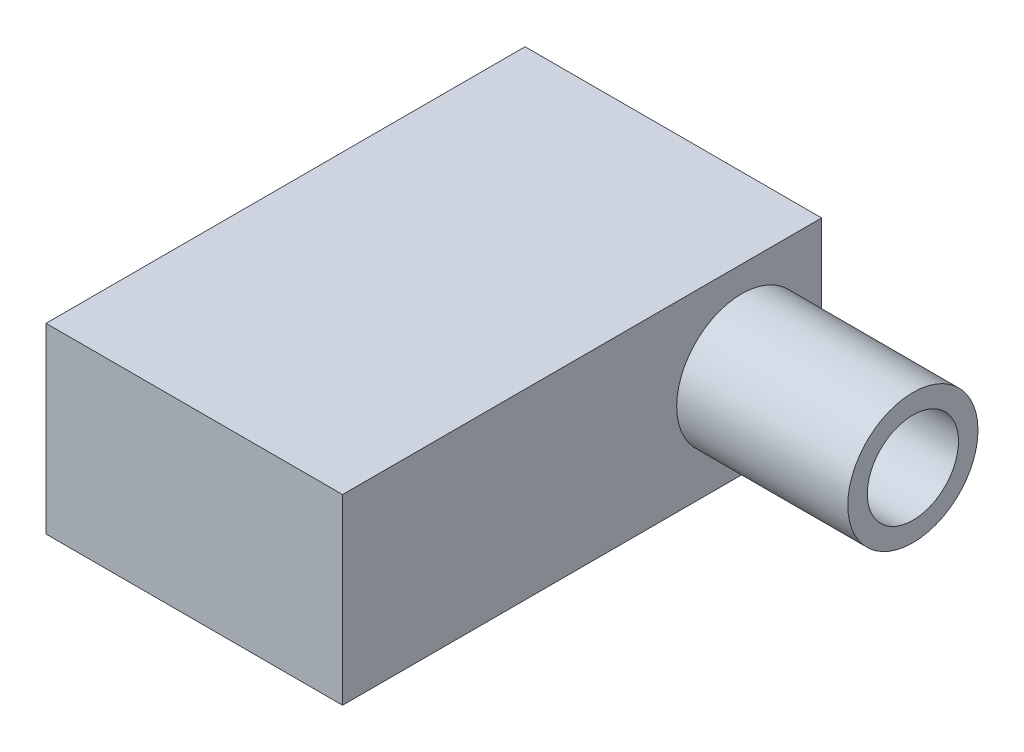
ISO-10303-21;
HEADER;
FILE_DESCRIPTION(('STEP AP214'),'2;1');
FILE_NAME('part.step','',(''),(''),'','','');
FILE_SCHEMA(('AUTOMOTIVE_DESIGN { 1 0 10303 214 1 1 1 1 }'));
ENDSEC;
DATA;
#1=APPLICATION_CONTEXT('core data for automotive mechanical design processes');
#2=APPLICATION_PROTOCOL_DEFINITION('international standard','automotive_design',2000,#1);
#3=PRODUCT_CONTEXT('',#1,'mechanical');
#4=PRODUCT('Part','Part','',(#3));
#5=PRODUCT_RELATED_PRODUCT_CATEGORY('part','',(#4));
#6=PRODUCT_DEFINITION_FORMATION('','',#4);
#7=PRODUCT_DEFINITION_CONTEXT('part definition',#1,'design');
#8=PRODUCT_DEFINITION('design','',#6,#7);
#9=PRODUCT_DEFINITION_SHAPE('','',#8);
#10=(LENGTH_UNIT() NAMED_UNIT(*) SI_UNIT(.MILLI.,.METRE.));
#11=(NAMED_UNIT(*) PLANE_ANGLE_UNIT() SI_UNIT($,.RADIAN.));
#12=(NAMED_UNIT(*) SI_UNIT($,.STERADIAN.) SOLID_ANGLE_UNIT());
#13=UNCERTAINTY_MEASURE_WITH_UNIT(LENGTH_MEASURE(1.E-05),#10,'distance_accuracy_value','');
#14=(GEOMETRIC_REPRESENTATION_CONTEXT(3) GLOBAL_UNCERTAINTY_ASSIGNED_CONTEXT((#13)) GLOBAL_UNIT_ASSIGNED_CONTEXT((#10,
#11,#12)) REPRESENTATION_CONTEXT('',''));
#15=CARTESIAN_POINT('',(0.,0.,0.));
#16=DIRECTION('',(0.,0.,1.));
#17=DIRECTION('',(1.,0.,0.));
#18=AXIS2_PLACEMENT_3D('',#15,#16,#17);
#19=CARTESIAN_POINT('',(0.,0.,0.));
#20=DIRECTION('',(0.,0.,1.));
#21=DIRECTION('',(1.,0.,0.));
#22=AXIS2_PLACEMENT_3D('',#19,#20,#21);
#23=PLANE('',#22);
#24=DIRECTION('',(0.,-1.,0.));
#25=VECTOR('',#24,1.);
#26=CARTESIAN_POINT('',(0.,0.,0.));
#27=LINE('',#26,#25);
#28=CARTESIAN_POINT('',(0.,0.,0.));
#29=VERTEX_POINT('',#28);
#30=CARTESIAN_POINT('',(0.,-80.,0.));
#31=VERTEX_POINT('',#30);
#32=EDGE_CURVE('E122',#29,#31,#27,.T.);
#33=ORIENTED_EDGE('',*,*,#32,.F.);
#34=DIRECTION('',(-1.,0.,0.));
#35=VECTOR('',#34,1.);
#36=CARTESIAN_POINT('',(0.,0.,0.));
#37=LINE('',#36,#35);
#38=CARTESIAN_POINT('',(130.,0.,0.));
#39=VERTEX_POINT('',#38);
#40=EDGE_CURVE('E202',#39,#29,#37,.T.);
#41=ORIENTED_EDGE('',*,*,#40,.F.);
#42=DIRECTION('',(0.,1.,0.));
#43=VECTOR('',#42,1.);
#44=CARTESIAN_POINT('',(130.,0.,0.));
#45=LINE('',#44,#43);
#46=CARTESIAN_POINT('',(130.,-80.,0.));
#47=VERTEX_POINT('',#46);
#48=EDGE_CURVE('E199',#47,#39,#45,.T.);
#49=ORIENTED_EDGE('',*,*,#48,.F.);
#50=DIRECTION('',(1.,0.,0.));
#51=VECTOR('',#50,1.);
#52=CARTESIAN_POINT('',(0.,-80.,0.));
#53=LINE('',#52,#51);
#54=EDGE_CURVE('E196',#31,#47,#53,.T.);
#55=ORIENTED_EDGE('',*,*,#54,.F.);
#56=EDGE_LOOP('',(#33,#41,#49,#55));
#57=FACE_BOUND('',#56,.T.);
#58=DIRECTION('',(0.,-1.,0.));
#59=VECTOR('',#58,1.);
#60=CARTESIAN_POINT('',(10.,-10.,0.));
#61=LINE('',#60,#59);
#62=CARTESIAN_POINT('',(10.,-10.,0.));
#63=VERTEX_POINT('',#62);
#64=CARTESIAN_POINT('',(10.,-70.,0.));
#65=VERTEX_POINT('',#64);
#66=EDGE_CURVE('E72',#63,#65,#61,.T.);
#67=ORIENTED_EDGE('',*,*,#66,.T.);
#68=DIRECTION('',(1.,0.,0.));
#69=VECTOR('',#68,1.);
#70=CARTESIAN_POINT('',(10.,-70.,0.));
#71=LINE('',#70,#69);
#72=CARTESIAN_POINT('',(120.,-70.,0.));
#73=VERTEX_POINT('',#72);
#74=EDGE_CURVE('E172',#65,#73,#71,.T.);
#75=ORIENTED_EDGE('',*,*,#74,.T.);
#76=DIRECTION('',(0.,1.,0.));
#77=VECTOR('',#76,1.);
#78=CARTESIAN_POINT('',(120.,-10.,0.));
#79=LINE('',#78,#77);
#80=CARTESIAN_POINT('',(120.,-10.,0.));
#81=VERTEX_POINT('',#80);
#82=EDGE_CURVE('E176',#73,#81,#79,.T.);
#83=ORIENTED_EDGE('',*,*,#82,.T.);
#84=DIRECTION('',(-1.,0.,0.));
#85=VECTOR('',#84,1.);
#86=CARTESIAN_POINT('',(10.,-10.,0.));
#87=LINE('',#86,#85);
#88=EDGE_CURVE('E159',#81,#63,#87,.T.);
#89=ORIENTED_EDGE('',*,*,#88,.T.);
#90=EDGE_LOOP('',(#67,#75,#83,#89));
#91=FACE_BOUND('',#90,.T.);
#92=ADVANCED_FACE('F47',(#57,#91),#23,.F.);
#93=CARTESIAN_POINT('',(0.,0.,200.));
#94=DIRECTION('',(1.,0.,0.));
#95=DIRECTION('',(0.,1.,0.));
#96=AXIS2_PLACEMENT_3D('',#93,#94,#95);
#97=PLANE('',#96);
#98=ORIENTED_EDGE('',*,*,#32,.T.);
#99=DIRECTION('',(0.,0.,-1.));
#100=VECTOR('',#99,1.);
#101=CARTESIAN_POINT('',(0.,-80.,200.));
#102=LINE('',#101,#100);
#103=CARTESIAN_POINT('',(0.,-80.,210.));
#104=VERTEX_POINT('',#103);
#105=EDGE_CURVE('E57',#104,#31,#102,.T.);
#106=ORIENTED_EDGE('',*,*,#105,.F.);
#107=DIRECTION('',(0.,-1.,0.));
#108=VECTOR('',#107,1.);
#109=CARTESIAN_POINT('',(0.,0.,210.));
#110=LINE('',#109,#108);
#111=CARTESIAN_POINT('',(0.,0.,210.));
#112=VERTEX_POINT('',#111);
#113=EDGE_CURVE('E120',#112,#104,#110,.T.);
#114=ORIENTED_EDGE('',*,*,#113,.F.);
#115=DIRECTION('',(0.,0.,-1.));
#116=VECTOR('',#115,1.);
#117=CARTESIAN_POINT('',(0.,0.,200.));
#118=LINE('',#117,#116);
#119=EDGE_CURVE('E205',#112,#29,#118,.T.);
#120=ORIENTED_EDGE('',*,*,#119,.T.);
#121=EDGE_LOOP('',(#98,#106,#114,#120));
#122=FACE_BOUND('',#121,.T.);
#123=ADVANCED_FACE('F49',(#122),#97,.F.);
#124=CARTESIAN_POINT('',(0.,-80.,200.));
#125=DIRECTION('',(0.,1.,0.));
#126=DIRECTION('',(0.,0.,1.));
#127=AXIS2_PLACEMENT_3D('',#124,#125,#126);
#128=PLANE('',#127);
#129=ORIENTED_EDGE('',*,*,#54,.T.);
#130=DIRECTION('',(0.,0.,-1.));
#131=VECTOR('',#130,1.);
#132=CARTESIAN_POINT('',(130.,-80.,200.));
#133=LINE('',#132,#131);
#134=CARTESIAN_POINT('',(130.,-80.,210.));
#135=VERTEX_POINT('',#134);
#136=EDGE_CURVE('E125',#135,#47,#133,.T.);
#137=ORIENTED_EDGE('',*,*,#136,.F.);
#138=DIRECTION('',(1.,0.,0.));
#139=VECTOR('',#138,1.);
#140=CARTESIAN_POINT('',(0.,-80.,210.));
#141=LINE('',#140,#139);
#142=EDGE_CURVE('E128',#104,#135,#141,.T.);
#143=ORIENTED_EDGE('',*,*,#142,.F.);
#144=ORIENTED_EDGE('',*,*,#105,.T.);
#145=EDGE_LOOP('',(#129,#137,#143,#144));
#146=FACE_BOUND('',#145,.T.);
#147=ADVANCED_FACE('F129',(#146),#128,.F.);
#148=CARTESIAN_POINT('',(130.,0.,200.));
#149=DIRECTION('',(-1.,0.,0.));
#150=DIRECTION('',(0.,0.,1.));
#151=AXIS2_PLACEMENT_3D('',#148,#149,#150);
#152=PLANE('',#151);
#153=CARTESIAN_POINT('',(130.,-39.7809153899423,35.0024670867136));
#154=DIRECTION('',(-1.,0.,0.));
#155=DIRECTION('',(0.,0.,1.));
#156=AXIS2_PLACEMENT_3D('',#153,#154,#155);
#157=CIRCLE('',#156,28.5357178964203);
#158=CARTESIAN_POINT('',(130.,-39.7809153899423,63.5381849831339));
#159=VERTEX_POINT('',#158);
#160=EDGE_CURVE('E11',#159,#159,#157,.F.);
#161=ORIENTED_EDGE('',*,*,#160,.F.);
#162=EDGE_LOOP('',(#161));
#163=FACE_BOUND('',#162,.T.);
#164=ORIENTED_EDGE('',*,*,#48,.T.);
#165=DIRECTION('',(0.,0.,-1.));
#166=VECTOR('',#165,1.);
#167=CARTESIAN_POINT('',(130.,0.,200.));
#168=LINE('',#167,#166);
#169=CARTESIAN_POINT('',(130.,0.,210.));
#170=VERTEX_POINT('',#169);
#171=EDGE_CURVE('E208',#170,#39,#168,.T.);
#172=ORIENTED_EDGE('',*,*,#171,.F.);
#173=DIRECTION('',(0.,1.,0.));
#174=VECTOR('',#173,1.);
#175=CARTESIAN_POINT('',(130.,0.,210.));
#176=LINE('',#175,#174);
#177=EDGE_CURVE('E135',#135,#170,#176,.T.);
#178=ORIENTED_EDGE('',*,*,#177,.F.);
#179=ORIENTED_EDGE('',*,*,#136,.T.);
#180=EDGE_LOOP('',(#164,#172,#178,#179));
#181=FACE_BOUND('',#180,.T.);
#182=ADVANCED_FACE('F215',(#163,#181),#152,.F.);
#183=CARTESIAN_POINT('',(0.,0.,200.));
#184=DIRECTION('',(0.,-1.,0.));
#185=DIRECTION('',(0.,0.,-1.));
#186=AXIS2_PLACEMENT_3D('',#183,#184,#185);
#187=PLANE('',#186);
#188=ORIENTED_EDGE('',*,*,#40,.T.);
#189=ORIENTED_EDGE('',*,*,#119,.F.);
#190=DIRECTION('',(-1.,0.,0.));
#191=VECTOR('',#190,1.);
#192=CARTESIAN_POINT('',(0.,0.,210.));
#193=LINE('',#192,#191);
#194=EDGE_CURVE('E140',#170,#112,#193,.T.);
#195=ORIENTED_EDGE('',*,*,#194,.F.);
#196=ORIENTED_EDGE('',*,*,#171,.T.);
#197=EDGE_LOOP('',(#188,#189,#195,#196));
#198=FACE_BOUND('',#197,.T.);
#199=ADVANCED_FACE('F220',(#198),#187,.F.);
#200=CARTESIAN_POINT('',(10.,-10.,200.));
#201=DIRECTION('',(1.,0.,0.));
#202=DIRECTION('',(0.,1.,0.));
#203=AXIS2_PLACEMENT_3D('',#200,#201,#202);
#204=PLANE('',#203);
#205=ORIENTED_EDGE('',*,*,#66,.F.);
#206=DIRECTION('',(0.,0.,-1.));
#207=VECTOR('',#206,1.);
#208=CARTESIAN_POINT('',(10.,-10.,200.));
#209=LINE('',#208,#207);
#210=CARTESIAN_POINT('',(10.,-10.,200.));
#211=VERTEX_POINT('',#210);
#212=EDGE_CURVE('E169',#211,#63,#209,.T.);
#213=ORIENTED_EDGE('',*,*,#212,.F.);
#214=DIRECTION('',(0.,-1.,0.));
#215=VECTOR('',#214,1.);
#216=CARTESIAN_POINT('',(10.,-10.,200.));
#217=LINE('',#216,#215);
#218=CARTESIAN_POINT('',(10.,-70.,200.));
#219=VERTEX_POINT('',#218);
#220=EDGE_CURVE('E154',#211,#219,#217,.T.);
#221=ORIENTED_EDGE('',*,*,#220,.T.);
#222=DIRECTION('',(0.,0.,-1.));
#223=VECTOR('',#222,1.);
#224=CARTESIAN_POINT('',(10.,-70.,200.));
#225=LINE('',#224,#223);
#226=EDGE_CURVE('E191',#219,#65,#225,.T.);
#227=ORIENTED_EDGE('',*,*,#226,.T.);
#228=EDGE_LOOP('',(#205,#213,#221,#227));
#229=FACE_BOUND('',#228,.T.);
#230=ADVANCED_FACE('F222',(#229),#204,.T.);
#231=CARTESIAN_POINT('',(10.,-70.,200.));
#232=DIRECTION('',(0.,1.,0.));
#233=DIRECTION('',(0.,0.,1.));
#234=AXIS2_PLACEMENT_3D('',#231,#232,#233);
#235=PLANE('',#234);
#236=ORIENTED_EDGE('',*,*,#74,.F.);
#237=ORIENTED_EDGE('',*,*,#226,.F.);
#238=DIRECTION('',(1.,0.,0.));
#239=VECTOR('',#238,1.);
#240=CARTESIAN_POINT('',(10.,-70.,200.));
#241=LINE('',#240,#239);
#242=CARTESIAN_POINT('',(120.,-70.,200.));
#243=VERTEX_POINT('',#242);
#244=EDGE_CURVE('E158',#219,#243,#241,.T.);
#245=ORIENTED_EDGE('',*,*,#244,.T.);
#246=DIRECTION('',(0.,0.,-1.));
#247=VECTOR('',#246,1.);
#248=CARTESIAN_POINT('',(120.,-70.,200.));
#249=LINE('',#248,#247);
#250=EDGE_CURVE('E188',#243,#73,#249,.T.);
#251=ORIENTED_EDGE('',*,*,#250,.T.);
#252=EDGE_LOOP('',(#236,#237,#245,#251));
#253=FACE_BOUND('',#252,.T.);
#254=ADVANCED_FACE('F228',(#253),#235,.T.);
#255=CARTESIAN_POINT('',(120.,-10.,200.));
#256=DIRECTION('',(-1.,0.,0.));
#257=DIRECTION('',(0.,-1.,0.));
#258=AXIS2_PLACEMENT_3D('',#255,#256,#257);
#259=PLANE('',#258);
#260=CARTESIAN_POINT('',(120.,-39.7809153899423,35.0024670867136));
#261=DIRECTION('',(-1.,0.,0.));
#262=DIRECTION('',(0.,-1.,0.));
#263=AXIS2_PLACEMENT_3D('',#260,#261,#262);
#264=CIRCLE('',#263,19.9895948553172);
#265=CARTESIAN_POINT('',(120.,-59.7705102452595,35.0024670867136));
#266=VERTEX_POINT('',#265);
#267=EDGE_CURVE('E51',#266,#266,#264,.T.);
#268=ORIENTED_EDGE('',*,*,#267,.F.);
#269=EDGE_LOOP('',(#268));
#270=FACE_BOUND('',#269,.T.);
#271=ORIENTED_EDGE('',*,*,#82,.F.);
#272=ORIENTED_EDGE('',*,*,#250,.F.);
#273=DIRECTION('',(0.,1.,0.));
#274=VECTOR('',#273,1.);
#275=CARTESIAN_POINT('',(120.,-10.,200.));
#276=LINE('',#275,#274);
#277=CARTESIAN_POINT('',(120.,-10.,200.));
#278=VERTEX_POINT('',#277);
#279=EDGE_CURVE('E163',#243,#278,#276,.T.);
#280=ORIENTED_EDGE('',*,*,#279,.T.);
#281=DIRECTION('',(0.,0.,-1.));
#282=VECTOR('',#281,1.);
#283=CARTESIAN_POINT('',(120.,-10.,200.));
#284=LINE('',#283,#282);
#285=EDGE_CURVE('E185',#278,#81,#284,.T.);
#286=ORIENTED_EDGE('',*,*,#285,.T.);
#287=EDGE_LOOP('',(#271,#272,#280,#286));
#288=FACE_BOUND('',#287,.T.);
#289=ADVANCED_FACE('F241',(#270,#288),#259,.T.);
#290=CARTESIAN_POINT('',(10.,-10.,200.));
#291=DIRECTION('',(0.,-1.,0.));
#292=DIRECTION('',(0.,0.,-1.));
#293=AXIS2_PLACEMENT_3D('',#290,#291,#292);
#294=PLANE('',#293);
#295=ORIENTED_EDGE('',*,*,#88,.F.);
#296=ORIENTED_EDGE('',*,*,#285,.F.);
#297=DIRECTION('',(-1.,0.,0.));
#298=VECTOR('',#297,1.);
#299=CARTESIAN_POINT('',(10.,-10.,200.));
#300=LINE('',#299,#298);
#301=EDGE_CURVE('E64',#278,#211,#300,.T.);
#302=ORIENTED_EDGE('',*,*,#301,.T.);
#303=ORIENTED_EDGE('',*,*,#212,.T.);
#304=EDGE_LOOP('',(#295,#296,#302,#303));
#305=FACE_BOUND('',#304,.T.);
#306=ADVANCED_FACE('F245',(#305),#294,.T.);
#307=CARTESIAN_POINT('',(0.,0.,200.));
#308=DIRECTION('',(0.,0.,1.));
#309=DIRECTION('',(1.,0.,0.));
#310=AXIS2_PLACEMENT_3D('',#307,#308,#309);
#311=PLANE('',#310);
#312=ORIENTED_EDGE('',*,*,#244,.F.);
#313=ORIENTED_EDGE('',*,*,#220,.F.);
#314=ORIENTED_EDGE('',*,*,#301,.F.);
#315=ORIENTED_EDGE('',*,*,#279,.F.);
#316=EDGE_LOOP('',(#312,#313,#314,#315));
#317=FACE_BOUND('',#316,.T.);
#318=ADVANCED_FACE('F249',(#317),#311,.F.);
#319=CARTESIAN_POINT('',(0.,0.,210.));
#320=DIRECTION('',(0.,0.,1.));
#321=DIRECTION('',(1.,0.,0.));
#322=AXIS2_PLACEMENT_3D('',#319,#320,#321);
#323=PLANE('',#322);
#324=ORIENTED_EDGE('',*,*,#113,.T.);
#325=ORIENTED_EDGE('',*,*,#142,.T.);
#326=ORIENTED_EDGE('',*,*,#177,.T.);
#327=ORIENTED_EDGE('',*,*,#194,.T.);
#328=EDGE_LOOP('',(#324,#325,#326,#327));
#329=FACE_BOUND('',#328,.T.);
#330=ADVANCED_FACE('F138',(#329),#323,.T.);
#331=CARTESIAN_POINT('',(205.,-39.7809153899423,35.0024670867136));
#332=DIRECTION('',(1.,0.,0.));
#333=DIRECTION('',(0.,0.,-1.));
#334=AXIS2_PLACEMENT_3D('',#331,#332,#333);
#335=PLANE('',#334);
#336=CARTESIAN_POINT('',(205.,-39.7809153899423,35.0024670867136));
#337=DIRECTION('',(1.,0.,0.));
#338=DIRECTION('',(0.,0.,-1.));
#339=AXIS2_PLACEMENT_3D('',#336,#337,#338);
#340=CIRCLE('',#339,28.5357178964203);
#341=CARTESIAN_POINT('',(205.,-39.7809153899423,6.46674919029335));
#342=VERTEX_POINT('',#341);
#343=EDGE_CURVE('E142',#342,#342,#340,.T.);
#344=ORIENTED_EDGE('',*,*,#343,.T.);
#345=EDGE_LOOP('',(#344));
#346=FACE_BOUND('',#345,.T.);
#347=CARTESIAN_POINT('',(205.,-39.7809153899423,35.0024670867136));
#348=DIRECTION('',(1.,0.,0.));
#349=DIRECTION('',(0.,0.,-1.));
#350=AXIS2_PLACEMENT_3D('',#347,#348,#349);
#351=CIRCLE('',#350,19.9895948553172);
#352=CARTESIAN_POINT('',(205.,-39.7809153899423,15.0128722313965));
#353=VERTEX_POINT('',#352);
#354=EDGE_CURVE('E146',#353,#353,#351,.T.);
#355=ORIENTED_EDGE('',*,*,#354,.F.);
#356=EDGE_LOOP('',(#355));
#357=FACE_BOUND('',#356,.T.);
#358=ADVANCED_FACE('F255',(#346,#357),#335,.T.);
#359=CARTESIAN_POINT('',(205.,-39.7809153899423,35.0024670867136));
#360=DIRECTION('',(-1.,0.,0.));
#361=DIRECTION('',(0.,0.,1.));
#362=AXIS2_PLACEMENT_3D('',#359,#360,#361);
#363=CYLINDRICAL_SURFACE('',#362,28.5357178964203);
#364=ORIENTED_EDGE('',*,*,#343,.F.);
#365=EDGE_LOOP('',(#364));
#366=FACE_BOUND('',#365,.T.);
#367=ORIENTED_EDGE('',*,*,#160,.T.);
#368=EDGE_LOOP('',(#367));
#369=FACE_BOUND('',#368,.T.);
#370=ADVANCED_FACE('F256',(#366,#369),#363,.T.);
#371=CARTESIAN_POINT('',(205.,-39.7809153899423,35.0024670867136));
#372=DIRECTION('',(-1.,0.,0.));
#373=DIRECTION('',(0.,0.,1.));
#374=AXIS2_PLACEMENT_3D('',#371,#372,#373);
#375=CYLINDRICAL_SURFACE('',#374,19.9895948553172);
#376=ORIENTED_EDGE('',*,*,#354,.T.);
#377=EDGE_LOOP('',(#376));
#378=FACE_BOUND('',#377,.T.);
#379=ORIENTED_EDGE('',*,*,#267,.T.);
#380=EDGE_LOOP('',(#379));
#381=FACE_BOUND('',#380,.T.);
#382=ADVANCED_FACE('F259',(#378,#381),#375,.F.);
#383=CLOSED_SHELL('',(#92,#123,#147,#182,#199,#230,#254,#289,#306,#318,#330,#358,#370,#382));
#384=MANIFOLD_SOLID_BREP('B2',#383);
#385=ADVANCED_BREP_SHAPE_REPRESENTATION('',(#18,#384),#14);
#386=SHAPE_DEFINITION_REPRESENTATION(#9,#385);
ENDSEC;
END-ISO-10303-21;
